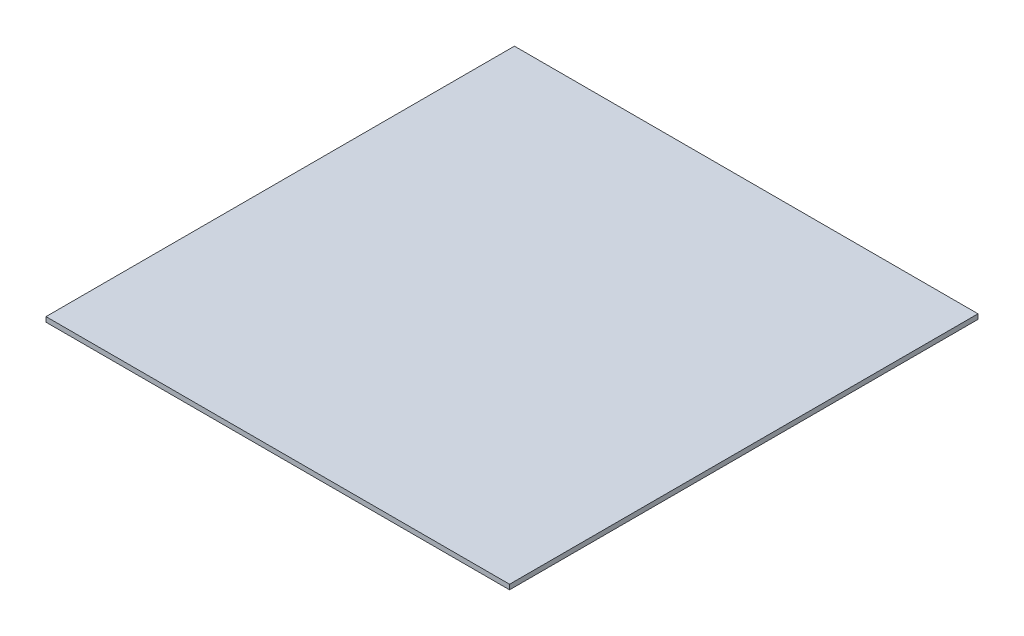
ISO-10303-21;
HEADER;
FILE_DESCRIPTION(('STEP AP214'),'2;1');
FILE_NAME('part.step','',(''),(''),'','','');
FILE_SCHEMA(('AUTOMOTIVE_DESIGN { 1 0 10303 214 1 1 1 1 }'));
ENDSEC;
DATA;
#1=APPLICATION_CONTEXT('core data for automotive mechanical design processes');
#2=APPLICATION_PROTOCOL_DEFINITION('international standard','automotive_design',2000,#1);
#3=PRODUCT_CONTEXT('',#1,'mechanical');
#4=PRODUCT('Part','Part','',(#3));
#5=PRODUCT_RELATED_PRODUCT_CATEGORY('part','',(#4));
#6=PRODUCT_DEFINITION_FORMATION('','',#4);
#7=PRODUCT_DEFINITION_CONTEXT('part definition',#1,'design');
#8=PRODUCT_DEFINITION('design','',#6,#7);
#9=PRODUCT_DEFINITION_SHAPE('','',#8);
#10=(LENGTH_UNIT() NAMED_UNIT(*) SI_UNIT(.MILLI.,.METRE.));
#11=(NAMED_UNIT(*) PLANE_ANGLE_UNIT() SI_UNIT($,.RADIAN.));
#12=(NAMED_UNIT(*) SI_UNIT($,.STERADIAN.) SOLID_ANGLE_UNIT());
#13=UNCERTAINTY_MEASURE_WITH_UNIT(LENGTH_MEASURE(1.E-05),#10,'distance_accuracy_value','');
#14=(GEOMETRIC_REPRESENTATION_CONTEXT(3) GLOBAL_UNCERTAINTY_ASSIGNED_CONTEXT((#13)) GLOBAL_UNIT_ASSIGNED_CONTEXT((#10,
#11,#12)) REPRESENTATION_CONTEXT('',''));
#15=CARTESIAN_POINT('',(0.,0.,0.));
#16=DIRECTION('',(0.,0.,1.));
#17=DIRECTION('',(1.,0.,0.));
#18=AXIS2_PLACEMENT_3D('',#15,#16,#17);
#19=CARTESIAN_POINT('',(-22.1532566225845,3.175,29.187541899351));
#20=DIRECTION('',(0.,0.,-1.));
#21=DIRECTION('',(-1.,0.,0.));
#22=AXIS2_PLACEMENT_3D('',#19,#20,#21);
#23=PLANE('',#22);
#24=DIRECTION('',(1.,0.,0.));
#25=VECTOR('',#24,1.);
#26=CARTESIAN_POINT('',(-22.1532566225845,0.,29.187541899351));
#27=LINE('',#26,#25);
#28=CARTESIAN_POINT('',(-22.1532566225845,0.,29.187541899351));
#29=VERTEX_POINT('',#28);
#30=CARTESIAN_POINT('',(279.471743377415,0.,29.187541899351));
#31=VERTEX_POINT('',#30);
#32=EDGE_CURVE('E94',#29,#31,#27,.T.);
#33=ORIENTED_EDGE('',*,*,#32,.T.);
#34=DIRECTION('',(0.,-1.,0.));
#35=VECTOR('',#34,1.);
#36=CARTESIAN_POINT('',(279.471743377415,3.175,29.187541899351));
#37=LINE('',#36,#35);
#38=CARTESIAN_POINT('',(279.471743377415,3.175,29.187541899351));
#39=VERTEX_POINT('',#38);
#40=EDGE_CURVE('E11',#39,#31,#37,.T.);
#41=ORIENTED_EDGE('',*,*,#40,.F.);
#42=DIRECTION('',(1.,0.,0.));
#43=VECTOR('',#42,1.);
#44=CARTESIAN_POINT('',(-22.1532566225845,3.175,29.187541899351));
#45=LINE('',#44,#43);
#46=CARTESIAN_POINT('',(-22.1532566225845,3.175,29.187541899351));
#47=VERTEX_POINT('',#46);
#48=EDGE_CURVE('E71',#47,#39,#45,.T.);
#49=ORIENTED_EDGE('',*,*,#48,.F.);
#50=DIRECTION('',(0.,-1.,0.));
#51=VECTOR('',#50,1.);
#52=CARTESIAN_POINT('',(-22.1532566225845,3.175,29.187541899351));
#53=LINE('',#52,#51);
#54=EDGE_CURVE('E90',#47,#29,#53,.T.);
#55=ORIENTED_EDGE('',*,*,#54,.T.);
#56=EDGE_LOOP('',(#33,#41,#49,#55));
#57=FACE_BOUND('',#56,.T.);
#58=ADVANCED_FACE('F32',(#57),#23,.F.);
#59=CARTESIAN_POINT('',(279.471743377415,3.175,-275.612458100649));
#60=DIRECTION('',(1.,0.,0.));
#61=DIRECTION('',(0.,0.,-1.));
#62=AXIS2_PLACEMENT_3D('',#59,#60,#61);
#63=PLANE('',#62);
#64=DIRECTION('',(0.,0.,1.));
#65=VECTOR('',#64,1.);
#66=CARTESIAN_POINT('',(279.471743377415,0.,-275.612458100649));
#67=LINE('',#66,#65);
#68=CARTESIAN_POINT('',(279.471743377415,0.,-275.612458100649));
#69=VERTEX_POINT('',#68);
#70=EDGE_CURVE('E80',#69,#31,#67,.T.);
#71=ORIENTED_EDGE('',*,*,#70,.F.);
#72=DIRECTION('',(0.,-1.,0.));
#73=VECTOR('',#72,1.);
#74=CARTESIAN_POINT('',(279.471743377415,3.175,-275.612458100649));
#75=LINE('',#74,#73);
#76=CARTESIAN_POINT('',(279.471743377415,3.175,-275.612458100649));
#77=VERTEX_POINT('',#76);
#78=EDGE_CURVE('E40',#77,#69,#75,.T.);
#79=ORIENTED_EDGE('',*,*,#78,.F.);
#80=DIRECTION('',(0.,0.,1.));
#81=VECTOR('',#80,1.);
#82=CARTESIAN_POINT('',(279.471743377415,3.175,-275.612458100649));
#83=LINE('',#82,#81);
#84=EDGE_CURVE('E78',#77,#39,#83,.T.);
#85=ORIENTED_EDGE('',*,*,#84,.T.);
#86=ORIENTED_EDGE('',*,*,#40,.T.);
#87=EDGE_LOOP('',(#71,#79,#85,#86));
#88=FACE_BOUND('',#87,.T.);
#89=ADVANCED_FACE('F77',(#88),#63,.T.);
#90=CARTESIAN_POINT('',(-22.1532566225845,3.175,-275.612458100649));
#91=DIRECTION('',(0.,0.,-1.));
#92=DIRECTION('',(-1.,0.,0.));
#93=AXIS2_PLACEMENT_3D('',#90,#91,#92);
#94=PLANE('',#93);
#95=DIRECTION('',(1.,0.,0.));
#96=VECTOR('',#95,1.);
#97=CARTESIAN_POINT('',(-22.1532566225845,0.,-275.612458100649));
#98=LINE('',#97,#96);
#99=CARTESIAN_POINT('',(-22.1532566225845,0.,-275.612458100649));
#100=VERTEX_POINT('',#99);
#101=EDGE_CURVE('E98',#100,#69,#98,.T.);
#102=ORIENTED_EDGE('',*,*,#101,.F.);
#103=DIRECTION('',(0.,-1.,0.));
#104=VECTOR('',#103,1.);
#105=CARTESIAN_POINT('',(-22.1532566225845,3.175,-275.612458100649));
#106=LINE('',#105,#104);
#107=CARTESIAN_POINT('',(-22.1532566225845,3.175,-275.612458100649));
#108=VERTEX_POINT('',#107);
#109=EDGE_CURVE('E63',#108,#100,#106,.T.);
#110=ORIENTED_EDGE('',*,*,#109,.F.);
#111=DIRECTION('',(1.,0.,0.));
#112=VECTOR('',#111,1.);
#113=CARTESIAN_POINT('',(-22.1532566225845,3.175,-275.612458100649));
#114=LINE('',#113,#112);
#115=EDGE_CURVE('E86',#108,#77,#114,.T.);
#116=ORIENTED_EDGE('',*,*,#115,.T.);
#117=ORIENTED_EDGE('',*,*,#78,.T.);
#118=EDGE_LOOP('',(#102,#110,#116,#117));
#119=FACE_BOUND('',#118,.T.);
#120=ADVANCED_FACE('F88',(#119),#94,.T.);
#121=CARTESIAN_POINT('',(-22.1532566225845,3.175,-275.612458100649));
#122=DIRECTION('',(1.,0.,0.));
#123=DIRECTION('',(0.,0.,-1.));
#124=AXIS2_PLACEMENT_3D('',#121,#122,#123);
#125=PLANE('',#124);
#126=DIRECTION('',(0.,0.,1.));
#127=VECTOR('',#126,1.);
#128=CARTESIAN_POINT('',(-22.1532566225845,0.,-275.612458100649));
#129=LINE('',#128,#127);
#130=EDGE_CURVE('E66',#100,#29,#129,.T.);
#131=ORIENTED_EDGE('',*,*,#130,.T.);
#132=ORIENTED_EDGE('',*,*,#54,.F.);
#133=DIRECTION('',(0.,0.,1.));
#134=VECTOR('',#133,1.);
#135=CARTESIAN_POINT('',(-22.1532566225845,3.175,-275.612458100649));
#136=LINE('',#135,#134);
#137=EDGE_CURVE('E48',#108,#47,#136,.T.);
#138=ORIENTED_EDGE('',*,*,#137,.F.);
#139=ORIENTED_EDGE('',*,*,#109,.T.);
#140=EDGE_LOOP('',(#131,#132,#138,#139));
#141=FACE_BOUND('',#140,.T.);
#142=ADVANCED_FACE('F111',(#141),#125,.F.);
#143=CARTESIAN_POINT('',(0.,3.175,0.));
#144=DIRECTION('',(0.,-1.,0.));
#145=DIRECTION('',(0.,0.,-1.));
#146=AXIS2_PLACEMENT_3D('',#143,#144,#145);
#147=PLANE('',#146);
#148=ORIENTED_EDGE('',*,*,#48,.T.);
#149=ORIENTED_EDGE('',*,*,#84,.F.);
#150=ORIENTED_EDGE('',*,*,#115,.F.);
#151=ORIENTED_EDGE('',*,*,#137,.T.);
#152=EDGE_LOOP('',(#148,#149,#150,#151));
#153=FACE_BOUND('',#152,.T.);
#154=ADVANCED_FACE('F85',(#153),#147,.F.);
#155=CARTESIAN_POINT('',(0.,0.,0.));
#156=DIRECTION('',(0.,-1.,0.));
#157=DIRECTION('',(0.,0.,-1.));
#158=AXIS2_PLACEMENT_3D('',#155,#156,#157);
#159=PLANE('',#158);
#160=ORIENTED_EDGE('',*,*,#32,.F.);
#161=ORIENTED_EDGE('',*,*,#130,.F.);
#162=ORIENTED_EDGE('',*,*,#101,.T.);
#163=ORIENTED_EDGE('',*,*,#70,.T.);
#164=EDGE_LOOP('',(#160,#161,#162,#163));
#165=FACE_BOUND('',#164,.T.);
#166=ADVANCED_FACE('F105',(#165),#159,.T.);
#167=CLOSED_SHELL('',(#58,#89,#120,#142,#154,#166));
#168=MANIFOLD_SOLID_BREP('B2',#167);
#169=ADVANCED_BREP_SHAPE_REPRESENTATION('',(#18,#168),#14);
#170=SHAPE_DEFINITION_REPRESENTATION(#9,#169);
ENDSEC;
END-ISO-10303-21;
